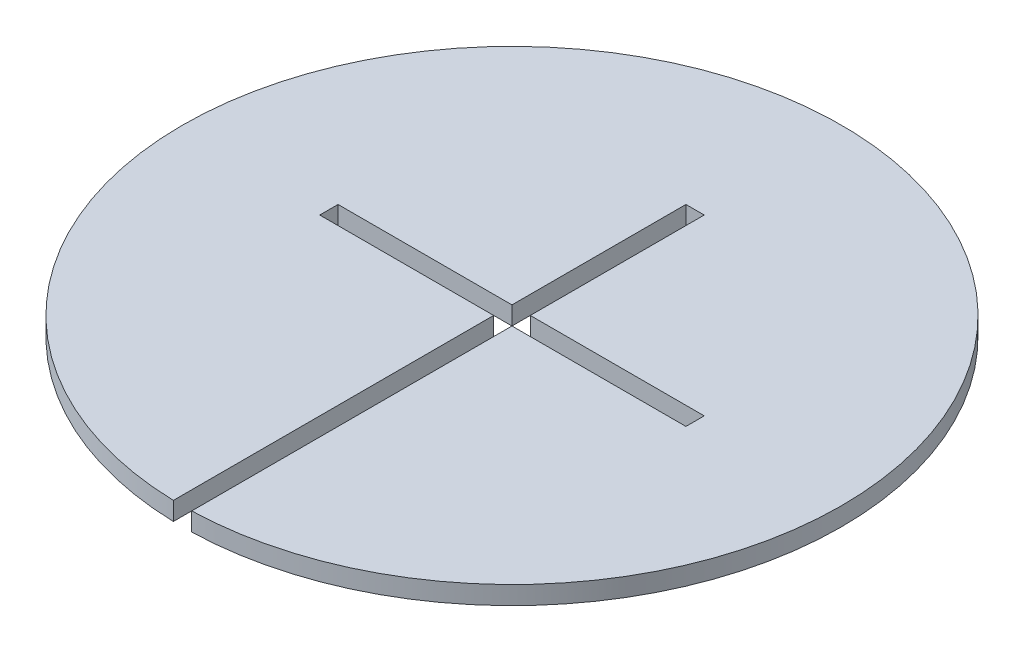
ISO-10303-21;
HEADER;
FILE_DESCRIPTION(('STEP AP214'),'2;1');
FILE_NAME('part.step','',(''),(''),'','','');
FILE_SCHEMA(('AUTOMOTIVE_DESIGN { 1 0 10303 214 1 1 1 1 }'));
ENDSEC;
DATA;
#1=APPLICATION_CONTEXT('core data for automotive mechanical design processes');
#2=APPLICATION_PROTOCOL_DEFINITION('international standard','automotive_design',2000,#1);
#3=PRODUCT_CONTEXT('',#1,'mechanical');
#4=PRODUCT('Part','Part','',(#3));
#5=PRODUCT_RELATED_PRODUCT_CATEGORY('part','',(#4));
#6=PRODUCT_DEFINITION_FORMATION('','',#4);
#7=PRODUCT_DEFINITION_CONTEXT('part definition',#1,'design');
#8=PRODUCT_DEFINITION('design','',#6,#7);
#9=PRODUCT_DEFINITION_SHAPE('','',#8);
#10=(LENGTH_UNIT() NAMED_UNIT(*) SI_UNIT(.MILLI.,.METRE.));
#11=(NAMED_UNIT(*) PLANE_ANGLE_UNIT() SI_UNIT($,.RADIAN.));
#12=(NAMED_UNIT(*) SI_UNIT($,.STERADIAN.) SOLID_ANGLE_UNIT());
#13=UNCERTAINTY_MEASURE_WITH_UNIT(LENGTH_MEASURE(1.E-05),#10,'distance_accuracy_value','');
#14=(GEOMETRIC_REPRESENTATION_CONTEXT(3) GLOBAL_UNCERTAINTY_ASSIGNED_CONTEXT((#13)) GLOBAL_UNIT_ASSIGNED_CONTEXT((#10,
#11,#12)) REPRESENTATION_CONTEXT('',''));
#15=CARTESIAN_POINT('',(0.,0.,0.));
#16=DIRECTION('',(0.,0.,1.));
#17=DIRECTION('',(1.,0.,0.));
#18=AXIS2_PLACEMENT_3D('',#15,#16,#17);
#19=CARTESIAN_POINT('',(-63.5,0.,-3.175));
#20=DIRECTION('',(0.,0.,-1.));
#21=DIRECTION('',(-1.,0.,0.));
#22=AXIS2_PLACEMENT_3D('',#19,#20,#21);
#23=PLANE('',#22);
#24=DIRECTION('',(-1.,0.,0.));
#25=VECTOR('',#24,1.);
#26=CARTESIAN_POINT('',(-63.5,6.35,-3.175));
#27=LINE('',#26,#25);
#28=CARTESIAN_POINT('',(63.5,6.35,-3.175));
#29=VERTEX_POINT('',#28);
#30=CARTESIAN_POINT('',(3.175,6.35,-3.175));
#31=VERTEX_POINT('',#30);
#32=EDGE_CURVE('E174',#29,#31,#27,.T.);
#33=ORIENTED_EDGE('',*,*,#32,.T.);
#34=DIRECTION('',(0.,-1.,0.));
#35=VECTOR('',#34,1.);
#36=CARTESIAN_POINT('',(3.175,0.,-3.175));
#37=LINE('',#36,#35);
#38=CARTESIAN_POINT('',(3.175,0.,-3.175));
#39=VERTEX_POINT('',#38);
#40=EDGE_CURVE('E11',#31,#39,#37,.T.);
#41=ORIENTED_EDGE('',*,*,#40,.T.);
#42=DIRECTION('',(-1.,0.,0.));
#43=VECTOR('',#42,1.);
#44=CARTESIAN_POINT('',(-63.5,0.,-3.175));
#45=LINE('',#44,#43);
#46=CARTESIAN_POINT('',(63.5,0.,-3.175));
#47=VERTEX_POINT('',#46);
#48=EDGE_CURVE('E149',#47,#39,#45,.T.);
#49=ORIENTED_EDGE('',*,*,#48,.F.);
#50=DIRECTION('',(0.,1.,0.));
#51=VECTOR('',#50,1.);
#52=CARTESIAN_POINT('',(63.5,0.,-3.175));
#53=LINE('',#52,#51);
#54=EDGE_CURVE('E170',#47,#29,#53,.T.);
#55=ORIENTED_EDGE('',*,*,#54,.T.);
#56=EDGE_LOOP('',(#33,#41,#49,#55));
#57=FACE_BOUND('',#56,.T.);
#58=ADVANCED_FACE('F37',(#57),#23,.F.);
#59=CARTESIAN_POINT('',(0.,6.35,0.));
#60=DIRECTION('',(0.,-1.,0.));
#61=DIRECTION('',(0.,0.,-1.));
#62=AXIS2_PLACEMENT_3D('',#59,#60,#61);
#63=CYLINDRICAL_SURFACE('',#62,114.3);
#64=CARTESIAN_POINT('',(0.,6.35,0.));
#65=DIRECTION('',(0.,1.,0.));
#66=DIRECTION('',(0.,0.,1.));
#67=AXIS2_PLACEMENT_3D('',#64,#65,#66);
#68=CIRCLE('',#67,114.3);
#69=CARTESIAN_POINT('',(3.17500000000001,6.35,114.255894268086));
#70=VERTEX_POINT('',#69);
#71=CARTESIAN_POINT('',(-3.17499999999999,6.35,114.255894268086));
#72=VERTEX_POINT('',#71);
#73=EDGE_CURVE('E208',#70,#72,#68,.T.);
#74=ORIENTED_EDGE('',*,*,#73,.F.);
#75=DIRECTION('',(0.,-1.,0.));
#76=VECTOR('',#75,1.);
#77=CARTESIAN_POINT('',(3.17500000000001,6.35,114.255894268086));
#78=LINE('',#77,#76);
#79=CARTESIAN_POINT('',(3.17500000000001,0.,114.255894268086));
#80=VERTEX_POINT('',#79);
#81=EDGE_CURVE('E204',#70,#80,#78,.T.);
#82=ORIENTED_EDGE('',*,*,#81,.T.);
#83=CARTESIAN_POINT('',(0.,0.,0.));
#84=DIRECTION('',(0.,1.,0.));
#85=DIRECTION('',(0.,0.,1.));
#86=AXIS2_PLACEMENT_3D('',#83,#84,#85);
#87=CIRCLE('',#86,114.3);
#88=CARTESIAN_POINT('',(-3.17499999999999,0.,114.255894268086));
#89=VERTEX_POINT('',#88);
#90=EDGE_CURVE('E207',#80,#89,#87,.T.);
#91=ORIENTED_EDGE('',*,*,#90,.T.);
#92=DIRECTION('',(0.,-1.,0.));
#93=VECTOR('',#92,1.);
#94=CARTESIAN_POINT('',(-3.17499999999999,6.35,114.255894268086));
#95=LINE('',#94,#93);
#96=EDGE_CURVE('E197',#89,#72,#95,.F.);
#97=ORIENTED_EDGE('',*,*,#96,.T.);
#98=EDGE_LOOP('',(#74,#82,#91,#97));
#99=FACE_BOUND('',#98,.T.);
#100=ADVANCED_FACE('F39',(#99),#63,.T.);
#101=CARTESIAN_POINT('',(0.,6.35,0.));
#102=DIRECTION('',(0.,1.,0.));
#103=DIRECTION('',(0.,0.,1.));
#104=AXIS2_PLACEMENT_3D('',#101,#102,#103);
#105=PLANE('',#104);
#106=DIRECTION('',(0.,0.,-1.));
#107=VECTOR('',#106,1.);
#108=CARTESIAN_POINT('',(3.17499999999999,6.35,-63.5));
#109=LINE('',#108,#107);
#110=CARTESIAN_POINT('',(3.17499999999999,6.35,-63.5));
#111=VERTEX_POINT('',#110);
#112=EDGE_CURVE('E131',#31,#111,#109,.T.);
#113=ORIENTED_EDGE('',*,*,#112,.F.);
#114=ORIENTED_EDGE('',*,*,#32,.F.);
#115=DIRECTION('',(0.,0.,-1.));
#116=VECTOR('',#115,1.);
#117=CARTESIAN_POINT('',(63.5,6.35,-3.175));
#118=LINE('',#117,#116);
#119=CARTESIAN_POINT('',(63.5,6.35,3.175));
#120=VERTEX_POINT('',#119);
#121=EDGE_CURVE('E157',#120,#29,#118,.T.);
#122=ORIENTED_EDGE('',*,*,#121,.F.);
#123=DIRECTION('',(1.,0.,0.));
#124=VECTOR('',#123,1.);
#125=CARTESIAN_POINT('',(-63.5,6.35,3.175));
#126=LINE('',#125,#124);
#127=CARTESIAN_POINT('',(3.17500000000001,6.35,3.175));
#128=VERTEX_POINT('',#127);
#129=EDGE_CURVE('E180',#128,#120,#126,.T.);
#130=ORIENTED_EDGE('',*,*,#129,.F.);
#131=DIRECTION('',(0.,0.,-1.));
#132=VECTOR('',#131,1.);
#133=CARTESIAN_POINT('',(3.17500000000001,6.35,114.3));
#134=LINE('',#133,#132);
#135=EDGE_CURVE('E194',#70,#128,#134,.T.);
#136=ORIENTED_EDGE('',*,*,#135,.F.);
#137=ORIENTED_EDGE('',*,*,#73,.T.);
#138=DIRECTION('',(0.,0.,1.));
#139=VECTOR('',#138,1.);
#140=CARTESIAN_POINT('',(-3.17499999999999,6.35,114.3));
#141=LINE('',#140,#139);
#142=CARTESIAN_POINT('',(-3.17499999999999,6.35,3.175));
#143=VERTEX_POINT('',#142);
#144=EDGE_CURVE('E198',#143,#72,#141,.T.);
#145=ORIENTED_EDGE('',*,*,#144,.F.);
#146=CARTESIAN_POINT('',(-63.5,6.35,3.175));
#147=VERTEX_POINT('',#146);
#148=EDGE_CURVE('E60',#147,#143,#126,.T.);
#149=ORIENTED_EDGE('',*,*,#148,.F.);
#150=DIRECTION('',(0.,0.,1.));
#151=VECTOR('',#150,1.);
#152=CARTESIAN_POINT('',(-63.5,6.35,-3.175));
#153=LINE('',#152,#151);
#154=CARTESIAN_POINT('',(-63.5,6.35,-3.175));
#155=VERTEX_POINT('',#154);
#156=EDGE_CURVE('E177',#155,#147,#153,.T.);
#157=ORIENTED_EDGE('',*,*,#156,.F.);
#158=CARTESIAN_POINT('',(-3.17500000000001,6.35,-3.175));
#159=VERTEX_POINT('',#158);
#160=EDGE_CURVE('E173',#159,#155,#27,.T.);
#161=ORIENTED_EDGE('',*,*,#160,.F.);
#162=DIRECTION('',(0.,0.,1.));
#163=VECTOR('',#162,1.);
#164=CARTESIAN_POINT('',(-3.17500000000001,6.35,-63.5));
#165=LINE('',#164,#163);
#166=CARTESIAN_POINT('',(-3.17500000000001,6.35,-63.5));
#167=VERTEX_POINT('',#166);
#168=EDGE_CURVE('E52',#167,#159,#165,.T.);
#169=ORIENTED_EDGE('',*,*,#168,.F.);
#170=DIRECTION('',(-1.,0.,0.));
#171=VECTOR('',#170,1.);
#172=CARTESIAN_POINT('',(-3.17500000000001,6.35,-63.5));
#173=LINE('',#172,#171);
#174=EDGE_CURVE('E151',#111,#167,#173,.T.);
#175=ORIENTED_EDGE('',*,*,#174,.F.);
#176=EDGE_LOOP('',(#113,#114,#122,#130,#136,#137,#145,#149,#157,#161,#169,#175));
#177=FACE_BOUND('',#176,.T.);
#178=ADVANCED_FACE('F224',(#177),#105,.T.);
#179=CARTESIAN_POINT('',(0.,0.,0.));
#180=DIRECTION('',(0.,1.,0.));
#181=DIRECTION('',(0.,0.,1.));
#182=AXIS2_PLACEMENT_3D('',#179,#180,#181);
#183=PLANE('',#182);
#184=ORIENTED_EDGE('',*,*,#48,.T.);
#185=DIRECTION('',(0.,0.,-1.));
#186=VECTOR('',#185,1.);
#187=CARTESIAN_POINT('',(3.17499999999999,0.,-63.5));
#188=LINE('',#187,#186);
#189=CARTESIAN_POINT('',(3.17499999999999,0.,-63.5));
#190=VERTEX_POINT('',#189);
#191=EDGE_CURVE('E129',#39,#190,#188,.T.);
#192=ORIENTED_EDGE('',*,*,#191,.T.);
#193=DIRECTION('',(-1.,0.,0.));
#194=VECTOR('',#193,1.);
#195=CARTESIAN_POINT('',(-3.17500000000001,0.,-63.5));
#196=LINE('',#195,#194);
#197=CARTESIAN_POINT('',(-3.17500000000001,0.,-63.5));
#198=VERTEX_POINT('',#197);
#199=EDGE_CURVE('E139',#190,#198,#196,.T.);
#200=ORIENTED_EDGE('',*,*,#199,.T.);
#201=DIRECTION('',(0.,0.,1.));
#202=VECTOR('',#201,1.);
#203=CARTESIAN_POINT('',(-3.17500000000001,0.,-63.5));
#204=LINE('',#203,#202);
#205=CARTESIAN_POINT('',(-3.17499999999999,0.,-3.175));
#206=VERTEX_POINT('',#205);
#207=EDGE_CURVE('E136',#198,#206,#204,.T.);
#208=ORIENTED_EDGE('',*,*,#207,.T.);
#209=CARTESIAN_POINT('',(-63.5,0.,-3.175));
#210=VERTEX_POINT('',#209);
#211=EDGE_CURVE('E161',#206,#210,#45,.T.);
#212=ORIENTED_EDGE('',*,*,#211,.T.);
#213=DIRECTION('',(0.,0.,1.));
#214=VECTOR('',#213,1.);
#215=CARTESIAN_POINT('',(-63.5,0.,-3.175));
#216=LINE('',#215,#214);
#217=CARTESIAN_POINT('',(-63.5,0.,3.175));
#218=VERTEX_POINT('',#217);
#219=EDGE_CURVE('E163',#210,#218,#216,.T.);
#220=ORIENTED_EDGE('',*,*,#219,.T.);
#221=DIRECTION('',(1.,0.,0.));
#222=VECTOR('',#221,1.);
#223=CARTESIAN_POINT('',(-63.5,0.,3.175));
#224=LINE('',#223,#222);
#225=CARTESIAN_POINT('',(-3.175,0.,3.175));
#226=VERTEX_POINT('',#225);
#227=EDGE_CURVE('E167',#218,#226,#224,.T.);
#228=ORIENTED_EDGE('',*,*,#227,.T.);
#229=DIRECTION('',(0.,0.,1.));
#230=VECTOR('',#229,1.);
#231=CARTESIAN_POINT('',(-3.17499999999999,0.,114.3));
#232=LINE('',#231,#230);
#233=EDGE_CURVE('E195',#226,#89,#232,.T.);
#234=ORIENTED_EDGE('',*,*,#233,.T.);
#235=ORIENTED_EDGE('',*,*,#90,.F.);
#236=DIRECTION('',(0.,0.,-1.));
#237=VECTOR('',#236,1.);
#238=CARTESIAN_POINT('',(3.17500000000001,0.,0.));
#239=LINE('',#238,#237);
#240=CARTESIAN_POINT('',(3.17500000000001,0.,3.175));
#241=VERTEX_POINT('',#240);
#242=EDGE_CURVE('E211',#80,#241,#239,.T.);
#243=ORIENTED_EDGE('',*,*,#242,.T.);
#244=CARTESIAN_POINT('',(63.5,0.,3.175));
#245=VERTEX_POINT('',#244);
#246=EDGE_CURVE('E166',#241,#245,#224,.T.);
#247=ORIENTED_EDGE('',*,*,#246,.T.);
#248=DIRECTION('',(0.,0.,-1.));
#249=VECTOR('',#248,1.);
#250=CARTESIAN_POINT('',(63.5,0.,-3.175));
#251=LINE('',#250,#249);
#252=EDGE_CURVE('E159',#245,#47,#251,.T.);
#253=ORIENTED_EDGE('',*,*,#252,.T.);
#254=EDGE_LOOP('',(#184,#192,#200,#208,#212,#220,#228,#234,#235,#243,#247,#253));
#255=FACE_BOUND('',#254,.T.);
#256=ADVANCED_FACE('F146',(#255),#183,.F.);
#257=CARTESIAN_POINT('',(3.17500000000001,0.,114.3));
#258=DIRECTION('',(1.,0.,0.));
#259=DIRECTION('',(0.,0.,-1.));
#260=AXIS2_PLACEMENT_3D('',#257,#258,#259);
#261=PLANE('',#260);
#262=ORIENTED_EDGE('',*,*,#135,.T.);
#263=DIRECTION('',(0.,-1.,0.));
#264=VECTOR('',#263,1.);
#265=CARTESIAN_POINT('',(3.17500000000001,0.,3.175));
#266=LINE('',#265,#264);
#267=EDGE_CURVE('E185',#128,#241,#266,.T.);
#268=ORIENTED_EDGE('',*,*,#267,.T.);
#269=ORIENTED_EDGE('',*,*,#242,.F.);
#270=ORIENTED_EDGE('',*,*,#81,.F.);
#271=EDGE_LOOP('',(#262,#268,#269,#270));
#272=FACE_BOUND('',#271,.T.);
#273=ADVANCED_FACE('F243',(#272),#261,.F.);
#274=CARTESIAN_POINT('',(-3.17499999999999,0.,114.3));
#275=DIRECTION('',(-1.,0.,0.));
#276=DIRECTION('',(0.,0.,1.));
#277=AXIS2_PLACEMENT_3D('',#274,#275,#276);
#278=PLANE('',#277);
#279=ORIENTED_EDGE('',*,*,#233,.F.);
#280=DIRECTION('',(0.,1.,0.));
#281=VECTOR('',#280,1.);
#282=CARTESIAN_POINT('',(-3.17499999999999,0.,3.175));
#283=LINE('',#282,#281);
#284=EDGE_CURVE('E216',#226,#143,#283,.T.);
#285=ORIENTED_EDGE('',*,*,#284,.T.);
#286=ORIENTED_EDGE('',*,*,#144,.T.);
#287=ORIENTED_EDGE('',*,*,#96,.F.);
#288=EDGE_LOOP('',(#279,#285,#286,#287));
#289=FACE_BOUND('',#288,.T.);
#290=ADVANCED_FACE('F249',(#289),#278,.F.);
#291=CARTESIAN_POINT('',(-63.5,0.,3.175));
#292=DIRECTION('',(0.,0.,1.));
#293=DIRECTION('',(1.,0.,0.));
#294=AXIS2_PLACEMENT_3D('',#291,#292,#293);
#295=PLANE('',#294);
#296=ORIENTED_EDGE('',*,*,#129,.T.);
#297=DIRECTION('',(0.,1.,0.));
#298=VECTOR('',#297,1.);
#299=CARTESIAN_POINT('',(63.5,0.,3.175));
#300=LINE('',#299,#298);
#301=EDGE_CURVE('E182',#245,#120,#300,.T.);
#302=ORIENTED_EDGE('',*,*,#301,.F.);
#303=ORIENTED_EDGE('',*,*,#246,.F.);
#304=ORIENTED_EDGE('',*,*,#267,.F.);
#305=EDGE_LOOP('',(#296,#302,#303,#304));
#306=FACE_BOUND('',#305,.T.);
#307=ADVANCED_FACE('F252',(#306),#295,.F.);
#308=ORIENTED_EDGE('',*,*,#227,.F.);
#309=DIRECTION('',(0.,1.,0.));
#310=VECTOR('',#309,1.);
#311=CARTESIAN_POINT('',(-63.5,0.,3.175));
#312=LINE('',#311,#310);
#313=EDGE_CURVE('E186',#218,#147,#312,.T.);
#314=ORIENTED_EDGE('',*,*,#313,.T.);
#315=ORIENTED_EDGE('',*,*,#148,.T.);
#316=ORIENTED_EDGE('',*,*,#284,.F.);
#317=EDGE_LOOP('',(#308,#314,#315,#316));
#318=FACE_BOUND('',#317,.T.);
#319=ADVANCED_FACE('F250',(#318),#295,.F.);
#320=CARTESIAN_POINT('',(63.5,0.,-3.175));
#321=DIRECTION('',(1.,0.,0.));
#322=DIRECTION('',(0.,0.,-1.));
#323=AXIS2_PLACEMENT_3D('',#320,#321,#322);
#324=PLANE('',#323);
#325=ORIENTED_EDGE('',*,*,#121,.T.);
#326=ORIENTED_EDGE('',*,*,#54,.F.);
#327=ORIENTED_EDGE('',*,*,#252,.F.);
#328=ORIENTED_EDGE('',*,*,#301,.T.);
#329=EDGE_LOOP('',(#325,#326,#327,#328));
#330=FACE_BOUND('',#329,.T.);
#331=ADVANCED_FACE('F237',(#330),#324,.F.);
#332=CARTESIAN_POINT('',(-63.5,0.,-3.175));
#333=DIRECTION('',(-1.,0.,0.));
#334=DIRECTION('',(0.,0.,1.));
#335=AXIS2_PLACEMENT_3D('',#332,#333,#334);
#336=PLANE('',#335);
#337=ORIENTED_EDGE('',*,*,#156,.T.);
#338=ORIENTED_EDGE('',*,*,#313,.F.);
#339=ORIENTED_EDGE('',*,*,#219,.F.);
#340=DIRECTION('',(0.,1.,0.));
#341=VECTOR('',#340,1.);
#342=CARTESIAN_POINT('',(-63.5,0.,-3.175));
#343=LINE('',#342,#341);
#344=EDGE_CURVE('E188',#210,#155,#343,.T.);
#345=ORIENTED_EDGE('',*,*,#344,.T.);
#346=EDGE_LOOP('',(#337,#338,#339,#345));
#347=FACE_BOUND('',#346,.T.);
#348=ADVANCED_FACE('F227',(#347),#336,.F.);
#349=ORIENTED_EDGE('',*,*,#211,.F.);
#350=DIRECTION('',(0.,1.,0.));
#351=VECTOR('',#350,1.);
#352=CARTESIAN_POINT('',(-3.17499999999999,0.,-3.175));
#353=LINE('',#352,#351);
#354=EDGE_CURVE('E45',#206,#159,#353,.T.);
#355=ORIENTED_EDGE('',*,*,#354,.T.);
#356=ORIENTED_EDGE('',*,*,#160,.T.);
#357=ORIENTED_EDGE('',*,*,#344,.F.);
#358=EDGE_LOOP('',(#349,#355,#356,#357));
#359=FACE_BOUND('',#358,.T.);
#360=ADVANCED_FACE('F220',(#359),#23,.F.);
#361=CARTESIAN_POINT('',(3.17499999999999,0.,-63.5));
#362=DIRECTION('',(1.,0.,0.));
#363=DIRECTION('',(0.,0.,-1.));
#364=AXIS2_PLACEMENT_3D('',#361,#362,#363);
#365=PLANE('',#364);
#366=ORIENTED_EDGE('',*,*,#112,.T.);
#367=DIRECTION('',(0.,1.,0.));
#368=VECTOR('',#367,1.);
#369=CARTESIAN_POINT('',(3.17499999999999,0.,-63.5));
#370=LINE('',#369,#368);
#371=EDGE_CURVE('E125',#190,#111,#370,.T.);
#372=ORIENTED_EDGE('',*,*,#371,.F.);
#373=ORIENTED_EDGE('',*,*,#191,.F.);
#374=ORIENTED_EDGE('',*,*,#40,.F.);
#375=EDGE_LOOP('',(#366,#372,#373,#374));
#376=FACE_BOUND('',#375,.T.);
#377=ADVANCED_FACE('F127',(#376),#365,.F.);
#378=CARTESIAN_POINT('',(-3.17500000000001,0.,-63.5));
#379=DIRECTION('',(-1.,0.,0.));
#380=DIRECTION('',(0.,0.,1.));
#381=AXIS2_PLACEMENT_3D('',#378,#379,#380);
#382=PLANE('',#381);
#383=ORIENTED_EDGE('',*,*,#207,.F.);
#384=DIRECTION('',(0.,1.,0.));
#385=VECTOR('',#384,1.);
#386=CARTESIAN_POINT('',(-3.17500000000001,0.,-63.5));
#387=LINE('',#386,#385);
#388=EDGE_CURVE('E135',#198,#167,#387,.T.);
#389=ORIENTED_EDGE('',*,*,#388,.T.);
#390=ORIENTED_EDGE('',*,*,#168,.T.);
#391=ORIENTED_EDGE('',*,*,#354,.F.);
#392=EDGE_LOOP('',(#383,#389,#390,#391));
#393=FACE_BOUND('',#392,.T.);
#394=ADVANCED_FACE('F231',(#393),#382,.F.);
#395=CARTESIAN_POINT('',(-3.17500000000001,0.,-63.5));
#396=DIRECTION('',(0.,0.,-1.));
#397=DIRECTION('',(-1.,0.,0.));
#398=AXIS2_PLACEMENT_3D('',#395,#396,#397);
#399=PLANE('',#398);
#400=ORIENTED_EDGE('',*,*,#174,.T.);
#401=ORIENTED_EDGE('',*,*,#388,.F.);
#402=ORIENTED_EDGE('',*,*,#199,.F.);
#403=ORIENTED_EDGE('',*,*,#371,.T.);
#404=EDGE_LOOP('',(#400,#401,#402,#403));
#405=FACE_BOUND('',#404,.T.);
#406=ADVANCED_FACE('F140',(#405),#399,.F.);
#407=CLOSED_SHELL('',(#58,#100,#178,#256,#273,#290,#307,#319,#331,#348,#360,#377,#394,#406));
#408=MANIFOLD_SOLID_BREP('B2',#407);
#409=ADVANCED_BREP_SHAPE_REPRESENTATION('',(#18,#408),#14);
#410=SHAPE_DEFINITION_REPRESENTATION(#9,#409);
ENDSEC;
END-ISO-10303-21;
